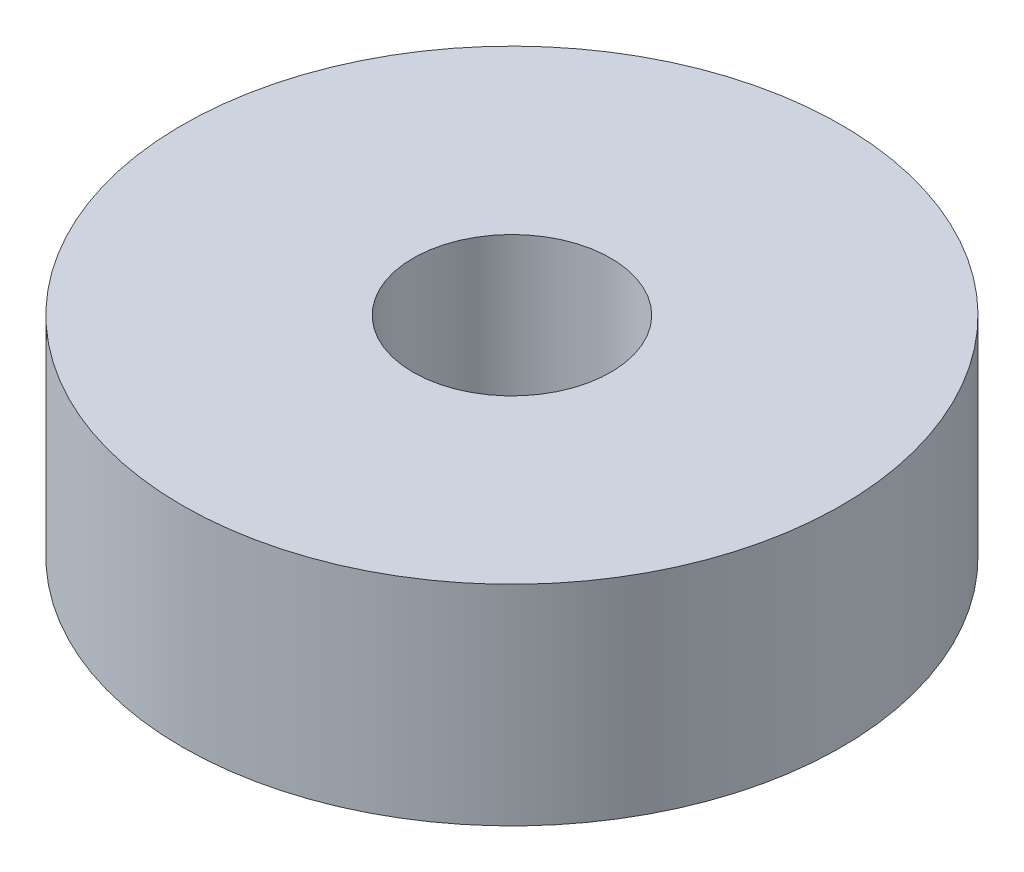
ISO-10303-21;
HEADER;
FILE_DESCRIPTION(('STEP AP214'),'2;1');
FILE_NAME('part.step','',(''),(''),'','','');
FILE_SCHEMA(('AUTOMOTIVE_DESIGN { 1 0 10303 214 1 1 1 1 }'));
ENDSEC;
DATA;
#1=APPLICATION_CONTEXT('core data for automotive mechanical design processes');
#2=APPLICATION_PROTOCOL_DEFINITION('international standard','automotive_design',2000,#1);
#3=PRODUCT_CONTEXT('',#1,'mechanical');
#4=PRODUCT('Part','Part','',(#3));
#5=PRODUCT_RELATED_PRODUCT_CATEGORY('part','',(#4));
#6=PRODUCT_DEFINITION_FORMATION('','',#4);
#7=PRODUCT_DEFINITION_CONTEXT('part definition',#1,'design');
#8=PRODUCT_DEFINITION('design','',#6,#7);
#9=PRODUCT_DEFINITION_SHAPE('','',#8);
#10=(LENGTH_UNIT() NAMED_UNIT(*) SI_UNIT(.MILLI.,.METRE.));
#11=(NAMED_UNIT(*) PLANE_ANGLE_UNIT() SI_UNIT($,.RADIAN.));
#12=(NAMED_UNIT(*) SI_UNIT($,.STERADIAN.) SOLID_ANGLE_UNIT());
#13=UNCERTAINTY_MEASURE_WITH_UNIT(LENGTH_MEASURE(1.E-05),#10,'distance_accuracy_value','');
#14=(GEOMETRIC_REPRESENTATION_CONTEXT(3) GLOBAL_UNCERTAINTY_ASSIGNED_CONTEXT((#13)) GLOBAL_UNIT_ASSIGNED_CONTEXT((#10,
#11,#12)) REPRESENTATION_CONTEXT('',''));
#15=CARTESIAN_POINT('',(0.,0.,0.));
#16=DIRECTION('',(0.,0.,1.));
#17=DIRECTION('',(1.,0.,0.));
#18=AXIS2_PLACEMENT_3D('',#15,#16,#17);
#19=CARTESIAN_POINT('',(36.2892605844644,3.175,-78.276137225575));
#20=DIRECTION('',(0.,1.,0.));
#21=DIRECTION('',(0.,0.,1.));
#22=AXIS2_PLACEMENT_3D('',#19,#20,#21);
#23=PLANE('',#22);
#24=CARTESIAN_POINT('',(36.2892605844644,3.175,-78.276137225575));
#25=DIRECTION('',(0.,1.,0.));
#26=DIRECTION('',(0.,0.,1.));
#27=AXIS2_PLACEMENT_3D('',#24,#25,#26);
#28=CIRCLE('',#27,5.);
#29=CARTESIAN_POINT('',(36.2892605844644,3.175,-73.276137225575));
#30=VERTEX_POINT('',#29);
#31=EDGE_CURVE('E10',#30,#30,#28,.T.);
#32=ORIENTED_EDGE('',*,*,#31,.T.);
#33=EDGE_LOOP('',(#32));
#34=FACE_BOUND('',#33,.T.);
#35=CARTESIAN_POINT('',(36.2892605844644,3.175,-78.276137225575));
#36=DIRECTION('',(0.,1.,0.));
#37=DIRECTION('',(0.,0.,1.));
#38=AXIS2_PLACEMENT_3D('',#35,#36,#37);
#39=CIRCLE('',#38,1.49999999999998);
#40=CARTESIAN_POINT('',(36.2892605844644,3.175,-76.776137225575));
#41=VERTEX_POINT('',#40);
#42=EDGE_CURVE('E44',#41,#41,#39,.T.);
#43=ORIENTED_EDGE('',*,*,#42,.F.);
#44=EDGE_LOOP('',(#43));
#45=FACE_BOUND('',#44,.T.);
#46=ADVANCED_FACE('F33',(#34,#45),#23,.T.);
#47=CARTESIAN_POINT('',(36.2892605844644,0.,-78.276137225575));
#48=DIRECTION('',(0.,1.,0.));
#49=DIRECTION('',(0.,0.,1.));
#50=AXIS2_PLACEMENT_3D('',#47,#48,#49);
#51=PLANE('',#50);
#52=CARTESIAN_POINT('',(36.2892605844644,0.,-78.276137225575));
#53=DIRECTION('',(0.,1.,0.));
#54=DIRECTION('',(0.,0.,1.));
#55=AXIS2_PLACEMENT_3D('',#52,#53,#54);
#56=CIRCLE('',#55,5.);
#57=CARTESIAN_POINT('',(36.2892605844644,0.,-73.276137225575));
#58=VERTEX_POINT('',#57);
#59=EDGE_CURVE('E37',#58,#58,#56,.T.);
#60=ORIENTED_EDGE('',*,*,#59,.F.);
#61=EDGE_LOOP('',(#60));
#62=FACE_BOUND('',#61,.T.);
#63=CARTESIAN_POINT('',(36.2892605844644,0.,-78.276137225575));
#64=DIRECTION('',(0.,1.,0.));
#65=DIRECTION('',(0.,0.,1.));
#66=AXIS2_PLACEMENT_3D('',#63,#64,#65);
#67=CIRCLE('',#66,1.49999999999998);
#68=CARTESIAN_POINT('',(36.2892605844644,0.,-76.776137225575));
#69=VERTEX_POINT('',#68);
#70=EDGE_CURVE('E46',#69,#69,#67,.T.);
#71=ORIENTED_EDGE('',*,*,#70,.T.);
#72=EDGE_LOOP('',(#71));
#73=FACE_BOUND('',#72,.T.);
#74=ADVANCED_FACE('F56',(#62,#73),#51,.F.);
#75=CARTESIAN_POINT('',(36.2892605844644,3.175,-78.276137225575));
#76=DIRECTION('',(0.,-1.,0.));
#77=DIRECTION('',(0.,0.,-1.));
#78=AXIS2_PLACEMENT_3D('',#75,#76,#77);
#79=CYLINDRICAL_SURFACE('',#78,5.);
#80=ORIENTED_EDGE('',*,*,#31,.F.);
#81=EDGE_LOOP('',(#80));
#82=FACE_BOUND('',#81,.T.);
#83=ORIENTED_EDGE('',*,*,#59,.T.);
#84=EDGE_LOOP('',(#83));
#85=FACE_BOUND('',#84,.T.);
#86=ADVANCED_FACE('F35',(#82,#85),#79,.T.);
#87=CARTESIAN_POINT('',(36.2892605844644,3.175,-78.276137225575));
#88=DIRECTION('',(0.,-1.,0.));
#89=DIRECTION('',(0.,0.,-1.));
#90=AXIS2_PLACEMENT_3D('',#87,#88,#89);
#91=CYLINDRICAL_SURFACE('',#90,1.49999999999998);
#92=ORIENTED_EDGE('',*,*,#42,.T.);
#93=EDGE_LOOP('',(#92));
#94=FACE_BOUND('',#93,.T.);
#95=ORIENTED_EDGE('',*,*,#70,.F.);
#96=EDGE_LOOP('',(#95));
#97=FACE_BOUND('',#96,.T.);
#98=ADVANCED_FACE('F52',(#94,#97),#91,.F.);
#99=CLOSED_SHELL('',(#46,#74,#86,#98));
#100=MANIFOLD_SOLID_BREP('B2',#99);
#101=ADVANCED_BREP_SHAPE_REPRESENTATION('',(#18,#100),#14);
#102=SHAPE_DEFINITION_REPRESENTATION(#9,#101);
ENDSEC;
END-ISO-10303-21;
